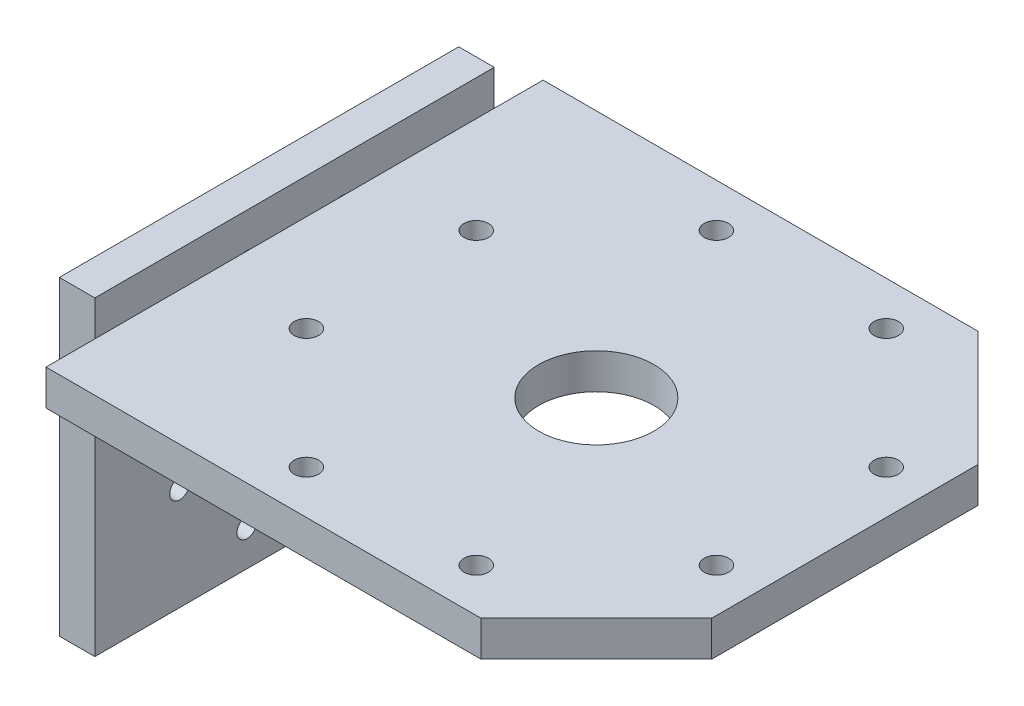
ISO-10303-21;
HEADER;
FILE_DESCRIPTION(('STEP AP214'),'2;1');
FILE_NAME('part.step','',(''),(''),'','','');
FILE_SCHEMA(('AUTOMOTIVE_DESIGN { 1 0 10303 214 1 1 1 1 }'));
ENDSEC;
DATA;
#1=APPLICATION_CONTEXT('core data for automotive mechanical design processes');
#2=APPLICATION_PROTOCOL_DEFINITION('international standard','automotive_design',2000,#1);
#3=PRODUCT_CONTEXT('',#1,'mechanical');
#4=PRODUCT('Part','Part','',(#3));
#5=PRODUCT_RELATED_PRODUCT_CATEGORY('part','',(#4));
#6=PRODUCT_DEFINITION_FORMATION('','',#4);
#7=PRODUCT_DEFINITION_CONTEXT('part definition',#1,'design');
#8=PRODUCT_DEFINITION('design','',#6,#7);
#9=PRODUCT_DEFINITION_SHAPE('','',#8);
#10=(LENGTH_UNIT() NAMED_UNIT(*) SI_UNIT(.MILLI.,.METRE.));
#11=(NAMED_UNIT(*) PLANE_ANGLE_UNIT() SI_UNIT($,.RADIAN.));
#12=(NAMED_UNIT(*) SI_UNIT($,.STERADIAN.) SOLID_ANGLE_UNIT());
#13=UNCERTAINTY_MEASURE_WITH_UNIT(LENGTH_MEASURE(1.E-05),#10,'distance_accuracy_value','');
#14=(GEOMETRIC_REPRESENTATION_CONTEXT(3) GLOBAL_UNCERTAINTY_ASSIGNED_CONTEXT((#13)) GLOBAL_UNIT_ASSIGNED_CONTEXT((#10,
#11,#12)) REPRESENTATION_CONTEXT('',''));
#15=CARTESIAN_POINT('',(0.,0.,0.));
#16=DIRECTION('',(0.,0.,1.));
#17=DIRECTION('',(1.,0.,0.));
#18=AXIS2_PLACEMENT_3D('',#15,#16,#17);
#19=CARTESIAN_POINT('',(-68.,0.,0.));
#20=DIRECTION('',(-1.,0.,0.));
#21=DIRECTION('',(0.,0.,1.));
#22=AXIS2_PLACEMENT_3D('',#19,#20,#21);
#23=PLANE('',#22);
#24=DIRECTION('',(0.,0.,1.));
#25=VECTOR('',#24,1.);
#26=CARTESIAN_POINT('',(-68.,28.,56.));
#27=LINE('',#26,#25);
#28=CARTESIAN_POINT('',(-68.,28.,-45.));
#29=VERTEX_POINT('',#28);
#30=CARTESIAN_POINT('',(-68.,28.,-11.4360721315195));
#31=VERTEX_POINT('',#30);
#32=EDGE_CURVE('E48',#29,#31,#27,.T.);
#33=ORIENTED_EDGE('',*,*,#32,.F.);
#34=DIRECTION('',(0.,1.,0.));
#35=VECTOR('',#34,1.);
#36=CARTESIAN_POINT('',(-68.,36.,-45.));
#37=LINE('',#36,#35);
#38=CARTESIAN_POINT('',(-68.,36.,-45.));
#39=VERTEX_POINT('',#38);
#40=EDGE_CURVE('E242',#29,#39,#37,.T.);
#41=ORIENTED_EDGE('',*,*,#40,.T.);
#42=DIRECTION('',(0.,0.,1.));
#43=VECTOR('',#42,1.);
#44=CARTESIAN_POINT('',(-68.,36.,45.));
#45=LINE('',#44,#43);
#46=CARTESIAN_POINT('',(-68.,36.,45.));
#47=VERTEX_POINT('',#46);
#48=EDGE_CURVE('E233',#39,#47,#45,.T.);
#49=ORIENTED_EDGE('',*,*,#48,.T.);
#50=DIRECTION('',(0.,-1.,0.));
#51=VECTOR('',#50,1.);
#52=CARTESIAN_POINT('',(-68.,-34.,45.));
#53=LINE('',#52,#51);
#54=CARTESIAN_POINT('',(-68.,28.,45.));
#55=VERTEX_POINT('',#54);
#56=EDGE_CURVE('E238',#47,#55,#53,.T.);
#57=ORIENTED_EDGE('',*,*,#56,.T.);
#58=CARTESIAN_POINT('',(-68.,28.,11.4360721315195));
#59=VERTEX_POINT('',#58);
#60=EDGE_CURVE('E155',#59,#55,#27,.T.);
#61=ORIENTED_EDGE('',*,*,#60,.F.);
#62=CARTESIAN_POINT('',(-68.,25.868626910316,10.7151361062225));
#63=DIRECTION('',(1.,0.,0.));
#64=DIRECTION('',(0.,0.,-1.));
#65=AXIS2_PLACEMENT_3D('',#62,#63,#64);
#66=CIRCLE('',#65,2.25);
#67=CARTESIAN_POINT('',(-68.,28.,9.99420008092553));
#68=VERTEX_POINT('',#67);
#69=EDGE_CURVE('E196',#68,#59,#66,.T.);
#70=ORIENTED_EDGE('',*,*,#69,.F.);
#71=CARTESIAN_POINT('',(-68.,28.,-9.99420008092556));
#72=VERTEX_POINT('',#71);
#73=EDGE_CURVE('E59',#72,#68,#27,.T.);
#74=ORIENTED_EDGE('',*,*,#73,.F.);
#75=CARTESIAN_POINT('',(-68.,25.868626910316,-10.7151361062225));
#76=DIRECTION('',(1.,0.,0.));
#77=DIRECTION('',(0.,0.,-1.));
#78=AXIS2_PLACEMENT_3D('',#75,#76,#77);
#79=CIRCLE('',#78,2.25);
#80=EDGE_CURVE('E194',#31,#72,#79,.T.);
#81=ORIENTED_EDGE('',*,*,#80,.F.);
#82=EDGE_LOOP('',(#33,#41,#49,#57,#61,#70,#74,#81));
#83=FACE_BOUND('',#82,.T.);
#84=ADVANCED_FACE('F39',(#83),#23,.F.);
#85=CARTESIAN_POINT('',(-68.,-10.7151361062225,-25.868626910316));
#86=DIRECTION('',(1.,0.,0.));
#87=DIRECTION('',(0.,0.,-1.));
#88=AXIS2_PLACEMENT_3D('',#85,#86,#87);
#89=CIRCLE('',#88,2.25);
#90=CARTESIAN_POINT('',(-68.,-10.7151361062225,-28.118626910316));
#91=VERTEX_POINT('',#90);
#92=EDGE_CURVE('E228',#91,#91,#89,.T.);
#93=ORIENTED_EDGE('',*,*,#92,.F.);
#94=EDGE_LOOP('',(#93));
#95=FACE_BOUND('',#94,.T.);
#96=CARTESIAN_POINT('',(-68.,-25.868626910316,-10.7151361062225));
#97=DIRECTION('',(1.,0.,0.));
#98=DIRECTION('',(0.,0.,-1.));
#99=AXIS2_PLACEMENT_3D('',#96,#97,#98);
#100=CIRCLE('',#99,2.25);
#101=CARTESIAN_POINT('',(-68.,-25.868626910316,-12.9651361062225));
#102=VERTEX_POINT('',#101);
#103=EDGE_CURVE('E224',#102,#102,#100,.T.);
#104=ORIENTED_EDGE('',*,*,#103,.F.);
#105=EDGE_LOOP('',(#104));
#106=FACE_BOUND('',#105,.T.);
#107=CARTESIAN_POINT('',(-68.,-25.868626910316,10.7151361062225));
#108=DIRECTION('',(1.,0.,0.));
#109=DIRECTION('',(0.,0.,-1.));
#110=AXIS2_PLACEMENT_3D('',#107,#108,#109);
#111=CIRCLE('',#110,2.25);
#112=CARTESIAN_POINT('',(-68.,-25.868626910316,8.46513610622251));
#113=VERTEX_POINT('',#112);
#114=EDGE_CURVE('E220',#113,#113,#111,.T.);
#115=ORIENTED_EDGE('',*,*,#114,.F.);
#116=EDGE_LOOP('',(#115));
#117=FACE_BOUND('',#116,.T.);
#118=CARTESIAN_POINT('',(-68.,-10.7151361062225,25.868626910316));
#119=DIRECTION('',(1.,0.,0.));
#120=DIRECTION('',(0.,0.,-1.));
#121=AXIS2_PLACEMENT_3D('',#118,#119,#120);
#122=CIRCLE('',#121,2.25);
#123=CARTESIAN_POINT('',(-68.,-10.7151361062225,23.618626910316));
#124=VERTEX_POINT('',#123);
#125=EDGE_CURVE('E211',#124,#124,#122,.T.);
#126=ORIENTED_EDGE('',*,*,#125,.F.);
#127=EDGE_LOOP('',(#126));
#128=FACE_BOUND('',#127,.T.);
#129=CARTESIAN_POINT('',(-68.,10.7151361062225,25.868626910316));
#130=DIRECTION('',(1.,0.,0.));
#131=DIRECTION('',(0.,0.,-1.));
#132=AXIS2_PLACEMENT_3D('',#129,#130,#131);
#133=CIRCLE('',#132,2.25);
#134=CARTESIAN_POINT('',(-68.,10.7151361062225,23.618626910316));
#135=VERTEX_POINT('',#134);
#136=EDGE_CURVE('E202',#135,#135,#133,.T.);
#137=ORIENTED_EDGE('',*,*,#136,.F.);
#138=EDGE_LOOP('',(#137));
#139=FACE_BOUND('',#138,.T.);
#140=CARTESIAN_POINT('',(-68.,-34.,-45.));
#141=VERTEX_POINT('',#140);
#142=CARTESIAN_POINT('',(-68.,20.,-45.));
#143=VERTEX_POINT('',#142);
#144=EDGE_CURVE('E247',#141,#143,#37,.T.);
#145=ORIENTED_EDGE('',*,*,#144,.T.);
#146=DIRECTION('',(0.,0.,1.));
#147=VECTOR('',#146,1.);
#148=CARTESIAN_POINT('',(-68.,20.,56.));
#149=LINE('',#148,#147);
#150=CARTESIAN_POINT('',(-68.,20.,45.));
#151=VERTEX_POINT('',#150);
#152=EDGE_CURVE('E11',#143,#151,#149,.T.);
#153=ORIENTED_EDGE('',*,*,#152,.T.);
#154=CARTESIAN_POINT('',(-68.,-34.,45.));
#155=VERTEX_POINT('',#154);
#156=EDGE_CURVE('E236',#151,#155,#53,.T.);
#157=ORIENTED_EDGE('',*,*,#156,.T.);
#158=DIRECTION('',(0.,0.,-1.));
#159=VECTOR('',#158,1.);
#160=CARTESIAN_POINT('',(-68.,-34.,-45.));
#161=LINE('',#160,#159);
#162=EDGE_CURVE('E241',#155,#141,#161,.T.);
#163=ORIENTED_EDGE('',*,*,#162,.T.);
#164=EDGE_LOOP('',(#145,#153,#157,#163));
#165=FACE_BOUND('',#164,.T.);
#166=CARTESIAN_POINT('',(-68.,10.7151361062225,-25.868626910316));
#167=DIRECTION('',(1.,0.,0.));
#168=DIRECTION('',(0.,0.,-1.));
#169=AXIS2_PLACEMENT_3D('',#166,#167,#168);
#170=CIRCLE('',#169,2.25);
#171=CARTESIAN_POINT('',(-68.,10.7151361062225,-28.118626910316));
#172=VERTEX_POINT('',#171);
#173=EDGE_CURVE('E186',#172,#172,#170,.T.);
#174=ORIENTED_EDGE('',*,*,#173,.F.);
#175=EDGE_LOOP('',(#174));
#176=FACE_BOUND('',#175,.T.);
#177=CARTESIAN_POINT('',(-68.,0.,0.));
#178=DIRECTION('',(1.,0.,0.));
#179=DIRECTION('',(0.,0.,-1.));
#180=AXIS2_PLACEMENT_3D('',#177,#178,#179);
#181=CIRCLE('',#180,6.);
#182=CARTESIAN_POINT('',(-68.,0.,-6.));
#183=VERTEX_POINT('',#182);
#184=EDGE_CURVE('E181',#183,#183,#181,.T.);
#185=ORIENTED_EDGE('',*,*,#184,.F.);
#186=EDGE_LOOP('',(#185));
#187=FACE_BOUND('',#186,.T.);
#188=ADVANCED_FACE('F347',(#95,#106,#117,#128,#139,#165,#176,#187),#23,.F.);
#189=CARTESIAN_POINT('',(-76.,0.,0.));
#190=DIRECTION('',(-1.,0.,0.));
#191=DIRECTION('',(0.,0.,1.));
#192=AXIS2_PLACEMENT_3D('',#189,#190,#191);
#193=PLANE('',#192);
#194=CARTESIAN_POINT('',(-76.,0.,0.));
#195=DIRECTION('',(1.,0.,0.));
#196=DIRECTION('',(0.,0.,-1.));
#197=AXIS2_PLACEMENT_3D('',#194,#195,#196);
#198=CIRCLE('',#197,22.15);
#199=CARTESIAN_POINT('',(-76.,0.,-22.15));
#200=VERTEX_POINT('',#199);
#201=EDGE_CURVE('E171',#200,#200,#198,.T.);
#202=ORIENTED_EDGE('',*,*,#201,.T.);
#203=EDGE_LOOP('',(#202));
#204=FACE_BOUND('',#203,.T.);
#205=CARTESIAN_POINT('',(-76.,10.7151361062225,-25.868626910316));
#206=DIRECTION('',(1.,0.,0.));
#207=DIRECTION('',(0.,0.,-1.));
#208=AXIS2_PLACEMENT_3D('',#205,#206,#207);
#209=CIRCLE('',#208,2.25);
#210=CARTESIAN_POINT('',(-76.,10.7151361062225,-28.118626910316));
#211=VERTEX_POINT('',#210);
#212=EDGE_CURVE('E189',#211,#211,#209,.T.);
#213=ORIENTED_EDGE('',*,*,#212,.T.);
#214=EDGE_LOOP('',(#213));
#215=FACE_BOUND('',#214,.T.);
#216=CARTESIAN_POINT('',(-76.,25.868626910316,10.7151361062225));
#217=DIRECTION('',(1.,0.,0.));
#218=DIRECTION('',(0.,0.,-1.));
#219=AXIS2_PLACEMENT_3D('',#216,#217,#218);
#220=CIRCLE('',#219,2.25);
#221=CARTESIAN_POINT('',(-76.,25.868626910316,8.46513610622251));
#222=VERTEX_POINT('',#221);
#223=EDGE_CURVE('E193',#222,#222,#220,.T.);
#224=ORIENTED_EDGE('',*,*,#223,.T.);
#225=EDGE_LOOP('',(#224));
#226=FACE_BOUND('',#225,.T.);
#227=CARTESIAN_POINT('',(-76.,-10.7151361062225,25.868626910316));
#228=DIRECTION('',(1.,0.,0.));
#229=DIRECTION('',(0.,0.,-1.));
#230=AXIS2_PLACEMENT_3D('',#227,#228,#229);
#231=CIRCLE('',#230,2.25);
#232=CARTESIAN_POINT('',(-76.,-10.7151361062225,23.618626910316));
#233=VERTEX_POINT('',#232);
#234=EDGE_CURVE('E208',#233,#233,#231,.T.);
#235=ORIENTED_EDGE('',*,*,#234,.T.);
#236=EDGE_LOOP('',(#235));
#237=FACE_BOUND('',#236,.T.);
#238=CARTESIAN_POINT('',(-76.,-25.868626910316,-10.7151361062225));
#239=DIRECTION('',(1.,0.,0.));
#240=DIRECTION('',(0.,0.,-1.));
#241=AXIS2_PLACEMENT_3D('',#238,#239,#240);
#242=CIRCLE('',#241,2.25);
#243=CARTESIAN_POINT('',(-76.,-25.868626910316,-12.9651361062225));
#244=VERTEX_POINT('',#243);
#245=EDGE_CURVE('E219',#244,#244,#242,.T.);
#246=ORIENTED_EDGE('',*,*,#245,.T.);
#247=EDGE_LOOP('',(#246));
#248=FACE_BOUND('',#247,.T.);
#249=DIRECTION('',(0.,0.,1.));
#250=VECTOR('',#249,1.);
#251=CARTESIAN_POINT('',(-76.,36.,45.));
#252=LINE('',#251,#250);
#253=CARTESIAN_POINT('',(-76.,36.,-45.));
#254=VERTEX_POINT('',#253);
#255=CARTESIAN_POINT('',(-76.,36.,45.));
#256=VERTEX_POINT('',#255);
#257=EDGE_CURVE('E235',#254,#256,#252,.T.);
#258=ORIENTED_EDGE('',*,*,#257,.F.);
#259=DIRECTION('',(0.,1.,0.));
#260=VECTOR('',#259,1.);
#261=CARTESIAN_POINT('',(-76.,36.,-45.));
#262=LINE('',#261,#260);
#263=CARTESIAN_POINT('',(-76.,-34.,-45.));
#264=VERTEX_POINT('',#263);
#265=EDGE_CURVE('E239',#264,#254,#262,.T.);
#266=ORIENTED_EDGE('',*,*,#265,.F.);
#267=DIRECTION('',(0.,0.,-1.));
#268=VECTOR('',#267,1.);
#269=CARTESIAN_POINT('',(-76.,-34.,-45.));
#270=LINE('',#269,#268);
#271=CARTESIAN_POINT('',(-76.,-34.,45.));
#272=VERTEX_POINT('',#271);
#273=EDGE_CURVE('E254',#272,#264,#270,.T.);
#274=ORIENTED_EDGE('',*,*,#273,.F.);
#275=DIRECTION('',(0.,-1.,0.));
#276=VECTOR('',#275,1.);
#277=CARTESIAN_POINT('',(-76.,-34.,45.));
#278=LINE('',#277,#276);
#279=EDGE_CURVE('E251',#256,#272,#278,.T.);
#280=ORIENTED_EDGE('',*,*,#279,.F.);
#281=EDGE_LOOP('',(#258,#266,#274,#280));
#282=FACE_BOUND('',#281,.T.);
#283=CARTESIAN_POINT('',(-76.,-10.7151361062225,-25.868626910316));
#284=DIRECTION('',(1.,0.,0.));
#285=DIRECTION('',(0.,0.,-1.));
#286=AXIS2_PLACEMENT_3D('',#283,#284,#285);
#287=CIRCLE('',#286,2.25);
#288=CARTESIAN_POINT('',(-76.,-10.7151361062225,-28.118626910316));
#289=VERTEX_POINT('',#288);
#290=EDGE_CURVE('E229',#289,#289,#287,.T.);
#291=ORIENTED_EDGE('',*,*,#290,.T.);
#292=EDGE_LOOP('',(#291));
#293=FACE_BOUND('',#292,.T.);
#294=CARTESIAN_POINT('',(-76.,-25.868626910316,10.7151361062225));
#295=DIRECTION('',(1.,0.,0.));
#296=DIRECTION('',(0.,0.,-1.));
#297=AXIS2_PLACEMENT_3D('',#294,#295,#296);
#298=CIRCLE('',#297,2.25);
#299=CARTESIAN_POINT('',(-76.,-25.868626910316,8.46513610622251));
#300=VERTEX_POINT('',#299);
#301=EDGE_CURVE('E212',#300,#300,#298,.T.);
#302=ORIENTED_EDGE('',*,*,#301,.T.);
#303=EDGE_LOOP('',(#302));
#304=FACE_BOUND('',#303,.T.);
#305=CARTESIAN_POINT('',(-76.,10.7151361062225,25.868626910316));
#306=DIRECTION('',(1.,0.,0.));
#307=DIRECTION('',(0.,0.,-1.));
#308=AXIS2_PLACEMENT_3D('',#305,#306,#307);
#309=CIRCLE('',#308,2.25);
#310=CARTESIAN_POINT('',(-76.,10.7151361062225,23.618626910316));
#311=VERTEX_POINT('',#310);
#312=EDGE_CURVE('E203',#311,#311,#309,.T.);
#313=ORIENTED_EDGE('',*,*,#312,.T.);
#314=EDGE_LOOP('',(#313));
#315=FACE_BOUND('',#314,.T.);
#316=CARTESIAN_POINT('',(-76.,25.868626910316,-10.7151361062225));
#317=DIRECTION('',(1.,0.,0.));
#318=DIRECTION('',(0.,0.,-1.));
#319=AXIS2_PLACEMENT_3D('',#316,#317,#318);
#320=CIRCLE('',#319,2.25);
#321=CARTESIAN_POINT('',(-76.,25.868626910316,-12.9651361062225));
#322=VERTEX_POINT('',#321);
#323=EDGE_CURVE('E187',#322,#322,#320,.T.);
#324=ORIENTED_EDGE('',*,*,#323,.T.);
#325=EDGE_LOOP('',(#324));
#326=FACE_BOUND('',#325,.T.);
#327=ADVANCED_FACE('F351',(#204,#215,#226,#237,#248,#282,#293,#304,#315,#326),#193,.T.);
#328=CARTESIAN_POINT('',(-68.,36.,45.));
#329=DIRECTION('',(0.,-1.,0.));
#330=DIRECTION('',(0.,0.,-1.));
#331=AXIS2_PLACEMENT_3D('',#328,#329,#330);
#332=PLANE('',#331);
#333=ORIENTED_EDGE('',*,*,#257,.T.);
#334=DIRECTION('',(-1.,0.,0.));
#335=VECTOR('',#334,1.);
#336=CARTESIAN_POINT('',(-68.,36.,45.));
#337=LINE('',#336,#335);
#338=EDGE_CURVE('E264',#47,#256,#337,.T.);
#339=ORIENTED_EDGE('',*,*,#338,.F.);
#340=ORIENTED_EDGE('',*,*,#48,.F.);
#341=DIRECTION('',(-1.,0.,0.));
#342=VECTOR('',#341,1.);
#343=CARTESIAN_POINT('',(-68.,36.,-45.));
#344=LINE('',#343,#342);
#345=EDGE_CURVE('E246',#39,#254,#344,.T.);
#346=ORIENTED_EDGE('',*,*,#345,.T.);
#347=EDGE_LOOP('',(#333,#339,#340,#346));
#348=FACE_BOUND('',#347,.T.);
#349=ADVANCED_FACE('F41',(#348),#332,.F.);
#350=CARTESIAN_POINT('',(-68.,-34.,45.));
#351=DIRECTION('',(0.,0.,-1.));
#352=DIRECTION('',(-1.,0.,0.));
#353=AXIS2_PLACEMENT_3D('',#350,#351,#352);
#354=PLANE('',#353);
#355=ORIENTED_EDGE('',*,*,#279,.T.);
#356=DIRECTION('',(-1.,0.,0.));
#357=VECTOR('',#356,1.);
#358=CARTESIAN_POINT('',(-68.,-34.,45.));
#359=LINE('',#358,#357);
#360=EDGE_CURVE('E263',#155,#272,#359,.T.);
#361=ORIENTED_EDGE('',*,*,#360,.F.);
#362=ORIENTED_EDGE('',*,*,#156,.F.);
#363=EDGE_CURVE('E245',#55,#151,#53,.T.);
#364=ORIENTED_EDGE('',*,*,#363,.F.);
#365=ORIENTED_EDGE('',*,*,#56,.F.);
#366=ORIENTED_EDGE('',*,*,#338,.T.);
#367=EDGE_LOOP('',(#355,#361,#362,#364,#365,#366));
#368=FACE_BOUND('',#367,.T.);
#369=ADVANCED_FACE('F364',(#368),#354,.F.);
#370=CARTESIAN_POINT('',(-68.,-34.,-45.));
#371=DIRECTION('',(0.,1.,0.));
#372=DIRECTION('',(0.,0.,1.));
#373=AXIS2_PLACEMENT_3D('',#370,#371,#372);
#374=PLANE('',#373);
#375=ORIENTED_EDGE('',*,*,#273,.T.);
#376=DIRECTION('',(-1.,0.,0.));
#377=VECTOR('',#376,1.);
#378=CARTESIAN_POINT('',(-68.,-34.,-45.));
#379=LINE('',#378,#377);
#380=EDGE_CURVE('E257',#141,#264,#379,.T.);
#381=ORIENTED_EDGE('',*,*,#380,.F.);
#382=ORIENTED_EDGE('',*,*,#162,.F.);
#383=ORIENTED_EDGE('',*,*,#360,.T.);
#384=EDGE_LOOP('',(#375,#381,#382,#383));
#385=FACE_BOUND('',#384,.T.);
#386=ADVANCED_FACE('F361',(#385),#374,.F.);
#387=CARTESIAN_POINT('',(-68.,36.,-45.));
#388=DIRECTION('',(0.,0.,1.));
#389=DIRECTION('',(1.,0.,0.));
#390=AXIS2_PLACEMENT_3D('',#387,#388,#389);
#391=PLANE('',#390);
#392=ORIENTED_EDGE('',*,*,#265,.T.);
#393=ORIENTED_EDGE('',*,*,#345,.F.);
#394=ORIENTED_EDGE('',*,*,#40,.F.);
#395=EDGE_CURVE('E248',#143,#29,#37,.T.);
#396=ORIENTED_EDGE('',*,*,#395,.F.);
#397=ORIENTED_EDGE('',*,*,#144,.F.);
#398=ORIENTED_EDGE('',*,*,#380,.T.);
#399=EDGE_LOOP('',(#392,#393,#394,#396,#397,#398));
#400=FACE_BOUND('',#399,.T.);
#401=ADVANCED_FACE('F276',(#400),#391,.F.);
#402=CARTESIAN_POINT('',(-68.,-10.7151361062225,-25.868626910316));
#403=DIRECTION('',(-1.,0.,0.));
#404=DIRECTION('',(0.,0.,1.));
#405=AXIS2_PLACEMENT_3D('',#402,#403,#404);
#406=CYLINDRICAL_SURFACE('',#405,2.25);
#407=ORIENTED_EDGE('',*,*,#92,.T.);
#408=EDGE_LOOP('',(#407));
#409=FACE_BOUND('',#408,.T.);
#410=ORIENTED_EDGE('',*,*,#290,.F.);
#411=EDGE_LOOP('',(#410));
#412=FACE_BOUND('',#411,.T.);
#413=ADVANCED_FACE('F357',(#409,#412),#406,.F.);
#414=CARTESIAN_POINT('',(-68.,-25.868626910316,-10.7151361062225));
#415=DIRECTION('',(-1.,0.,0.));
#416=DIRECTION('',(0.,0.,1.));
#417=AXIS2_PLACEMENT_3D('',#414,#415,#416);
#418=CYLINDRICAL_SURFACE('',#417,2.25);
#419=ORIENTED_EDGE('',*,*,#103,.T.);
#420=EDGE_LOOP('',(#419));
#421=FACE_BOUND('',#420,.T.);
#422=ORIENTED_EDGE('',*,*,#245,.F.);
#423=EDGE_LOOP('',(#422));
#424=FACE_BOUND('',#423,.T.);
#425=ADVANCED_FACE('F421',(#421,#424),#418,.F.);
#426=CARTESIAN_POINT('',(-68.,-25.868626910316,10.7151361062225));
#427=DIRECTION('',(-1.,0.,0.));
#428=DIRECTION('',(0.,0.,1.));
#429=AXIS2_PLACEMENT_3D('',#426,#427,#428);
#430=CYLINDRICAL_SURFACE('',#429,2.25);
#431=ORIENTED_EDGE('',*,*,#114,.T.);
#432=EDGE_LOOP('',(#431));
#433=FACE_BOUND('',#432,.T.);
#434=ORIENTED_EDGE('',*,*,#301,.F.);
#435=EDGE_LOOP('',(#434));
#436=FACE_BOUND('',#435,.T.);
#437=ADVANCED_FACE('F419',(#433,#436),#430,.F.);
#438=CARTESIAN_POINT('',(-68.,-10.7151361062225,25.868626910316));
#439=DIRECTION('',(-1.,0.,0.));
#440=DIRECTION('',(0.,0.,1.));
#441=AXIS2_PLACEMENT_3D('',#438,#439,#440);
#442=CYLINDRICAL_SURFACE('',#441,2.25);
#443=ORIENTED_EDGE('',*,*,#125,.T.);
#444=EDGE_LOOP('',(#443));
#445=FACE_BOUND('',#444,.T.);
#446=ORIENTED_EDGE('',*,*,#234,.F.);
#447=EDGE_LOOP('',(#446));
#448=FACE_BOUND('',#447,.T.);
#449=ADVANCED_FACE('F418',(#445,#448),#442,.F.);
#450=CARTESIAN_POINT('',(-68.,10.7151361062225,25.868626910316));
#451=DIRECTION('',(-1.,0.,0.));
#452=DIRECTION('',(0.,0.,1.));
#453=AXIS2_PLACEMENT_3D('',#450,#451,#452);
#454=CYLINDRICAL_SURFACE('',#453,2.25);
#455=ORIENTED_EDGE('',*,*,#136,.T.);
#456=EDGE_LOOP('',(#455));
#457=FACE_BOUND('',#456,.T.);
#458=ORIENTED_EDGE('',*,*,#312,.F.);
#459=EDGE_LOOP('',(#458));
#460=FACE_BOUND('',#459,.T.);
#461=ADVANCED_FACE('F415',(#457,#460),#454,.F.);
#462=CARTESIAN_POINT('',(-68.,25.868626910316,10.7151361062225));
#463=DIRECTION('',(-1.,0.,0.));
#464=DIRECTION('',(0.,0.,1.));
#465=AXIS2_PLACEMENT_3D('',#462,#463,#464);
#466=CYLINDRICAL_SURFACE('',#465,2.25);
#467=ORIENTED_EDGE('',*,*,#69,.T.);
#468=EDGE_CURVE('E205',#59,#68,#66,.T.);
#469=ORIENTED_EDGE('',*,*,#468,.T.);
#470=EDGE_LOOP('',(#467,#469));
#471=FACE_BOUND('',#470,.T.);
#472=ORIENTED_EDGE('',*,*,#223,.F.);
#473=EDGE_LOOP('',(#472));
#474=FACE_BOUND('',#473,.T.);
#475=ADVANCED_FACE('F408',(#471,#474),#466,.F.);
#476=CARTESIAN_POINT('',(-68.,25.868626910316,-10.7151361062225));
#477=DIRECTION('',(-1.,0.,0.));
#478=DIRECTION('',(0.,0.,1.));
#479=AXIS2_PLACEMENT_3D('',#476,#477,#478);
#480=CYLINDRICAL_SURFACE('',#479,2.25);
#481=ORIENTED_EDGE('',*,*,#80,.T.);
#482=EDGE_CURVE('E63',#72,#31,#79,.T.);
#483=ORIENTED_EDGE('',*,*,#482,.T.);
#484=EDGE_LOOP('',(#481,#483));
#485=FACE_BOUND('',#484,.T.);
#486=ORIENTED_EDGE('',*,*,#323,.F.);
#487=EDGE_LOOP('',(#486));
#488=FACE_BOUND('',#487,.T.);
#489=ADVANCED_FACE('F402',(#485,#488),#480,.F.);
#490=CARTESIAN_POINT('',(-68.,10.7151361062225,-25.868626910316));
#491=DIRECTION('',(-1.,0.,0.));
#492=DIRECTION('',(0.,0.,1.));
#493=AXIS2_PLACEMENT_3D('',#490,#491,#492);
#494=CYLINDRICAL_SURFACE('',#493,2.25);
#495=ORIENTED_EDGE('',*,*,#173,.T.);
#496=EDGE_LOOP('',(#495));
#497=FACE_BOUND('',#496,.T.);
#498=ORIENTED_EDGE('',*,*,#212,.F.);
#499=EDGE_LOOP('',(#498));
#500=FACE_BOUND('',#499,.T.);
#501=ADVANCED_FACE('F394',(#497,#500),#494,.F.);
#502=CARTESIAN_POINT('',(-68.,0.,0.));
#503=DIRECTION('',(-1.,0.,0.));
#504=DIRECTION('',(0.,0.,1.));
#505=AXIS2_PLACEMENT_3D('',#502,#503,#504);
#506=CYLINDRICAL_SURFACE('',#505,6.);
#507=CARTESIAN_POINT('',(-73.8,0.,0.));
#508=DIRECTION('',(1.,0.,0.));
#509=DIRECTION('',(0.,0.,-1.));
#510=AXIS2_PLACEMENT_3D('',#507,#508,#509);
#511=CIRCLE('',#510,6.);
#512=CARTESIAN_POINT('',(-73.8,0.,-6.));
#513=VERTEX_POINT('',#512);
#514=EDGE_CURVE('E43',#513,#513,#511,.T.);
#515=ORIENTED_EDGE('',*,*,#514,.F.);
#516=EDGE_LOOP('',(#515));
#517=FACE_BOUND('',#516,.T.);
#518=ORIENTED_EDGE('',*,*,#184,.T.);
#519=EDGE_LOOP('',(#518));
#520=FACE_BOUND('',#519,.T.);
#521=ADVANCED_FACE('F389',(#517,#520),#506,.F.);
#522=CARTESIAN_POINT('',(-73.8,0.,0.));
#523=DIRECTION('',(-1.,0.,0.));
#524=DIRECTION('',(0.,0.,1.));
#525=AXIS2_PLACEMENT_3D('',#522,#523,#524);
#526=CYLINDRICAL_SURFACE('',#525,22.15);
#527=CARTESIAN_POINT('',(-73.8,0.,0.));
#528=DIRECTION('',(1.,0.,0.));
#529=DIRECTION('',(0.,0.,-1.));
#530=AXIS2_PLACEMENT_3D('',#527,#528,#529);
#531=CIRCLE('',#530,22.15);
#532=CARTESIAN_POINT('',(-73.8,0.,-22.15));
#533=VERTEX_POINT('',#532);
#534=EDGE_CURVE('E172',#533,#533,#531,.T.);
#535=ORIENTED_EDGE('',*,*,#534,.T.);
#536=EDGE_LOOP('',(#535));
#537=FACE_BOUND('',#536,.T.);
#538=ORIENTED_EDGE('',*,*,#201,.F.);
#539=EDGE_LOOP('',(#538));
#540=FACE_BOUND('',#539,.T.);
#541=ADVANCED_FACE('F388',(#537,#540),#526,.F.);
#542=CARTESIAN_POINT('',(-73.8,0.,0.));
#543=DIRECTION('',(1.,0.,0.));
#544=DIRECTION('',(0.,0.,-1.));
#545=AXIS2_PLACEMENT_3D('',#542,#543,#544);
#546=PLANE('',#545);
#547=ORIENTED_EDGE('',*,*,#514,.T.);
#548=EDGE_LOOP('',(#547));
#549=FACE_BOUND('',#548,.T.);
#550=ORIENTED_EDGE('',*,*,#534,.F.);
#551=EDGE_LOOP('',(#550));
#552=FACE_BOUND('',#551,.T.);
#553=ADVANCED_FACE('F400',(#549,#552),#546,.F.);
#554=CARTESIAN_POINT('',(-68.,28.,56.));
#555=DIRECTION('',(1.,0.,0.));
#556=DIRECTION('',(0.,0.,-1.));
#557=AXIS2_PLACEMENT_3D('',#554,#555,#556);
#558=PLANE('',#557);
#559=CARTESIAN_POINT('',(-68.,28.,56.));
#560=VERTEX_POINT('',#559);
#561=EDGE_CURVE('E145',#55,#560,#27,.T.);
#562=ORIENTED_EDGE('',*,*,#561,.F.);
#563=ORIENTED_EDGE('',*,*,#363,.T.);
#564=CARTESIAN_POINT('',(-68.,20.,56.));
#565=VERTEX_POINT('',#564);
#566=EDGE_CURVE('E51',#151,#565,#149,.T.);
#567=ORIENTED_EDGE('',*,*,#566,.T.);
#568=DIRECTION('',(0.,-1.,0.));
#569=VECTOR('',#568,1.);
#570=CARTESIAN_POINT('',(-68.,28.,56.));
#571=LINE('',#570,#569);
#572=EDGE_CURVE('E162',#560,#565,#571,.T.);
#573=ORIENTED_EDGE('',*,*,#572,.F.);
#574=EDGE_LOOP('',(#562,#563,#567,#573));
#575=FACE_BOUND('',#574,.T.);
#576=ADVANCED_FACE('F166',(#575),#558,.F.);
#577=CARTESIAN_POINT('',(-68.,20.,-56.));
#578=VERTEX_POINT('',#577);
#579=EDGE_CURVE('E49',#578,#143,#149,.T.);
#580=ORIENTED_EDGE('',*,*,#579,.T.);
#581=ORIENTED_EDGE('',*,*,#395,.T.);
#582=CARTESIAN_POINT('',(-68.,28.,-56.));
#583=VERTEX_POINT('',#582);
#584=EDGE_CURVE('E157',#583,#29,#27,.T.);
#585=ORIENTED_EDGE('',*,*,#584,.F.);
#586=DIRECTION('',(0.,-1.,0.));
#587=VECTOR('',#586,1.);
#588=CARTESIAN_POINT('',(-68.,28.,-56.));
#589=LINE('',#588,#587);
#590=EDGE_CURVE('E289',#583,#578,#589,.T.);
#591=ORIENTED_EDGE('',*,*,#590,.T.);
#592=EDGE_LOOP('',(#580,#581,#585,#591));
#593=FACE_BOUND('',#592,.T.);
#594=ADVANCED_FACE('F283',(#593),#558,.F.);
#595=ORIENTED_EDGE('',*,*,#468,.F.);
#596=EDGE_CURVE('E156',#68,#59,#27,.T.);
#597=ORIENTED_EDGE('',*,*,#596,.F.);
#598=EDGE_LOOP('',(#595,#597));
#599=FACE_BOUND('',#598,.T.);
#600=ADVANCED_FACE('F551',(#599),#558,.F.);
#601=CARTESIAN_POINT('',(0.,28.,0.));
#602=DIRECTION('',(0.,-1.,0.));
#603=DIRECTION('',(0.,0.,-1.));
#604=AXIS2_PLACEMENT_3D('',#601,#602,#603);
#605=PLANE('',#604);
#606=ORIENTED_EDGE('',*,*,#584,.T.);
#607=ORIENTED_EDGE('',*,*,#32,.T.);
#608=EDGE_CURVE('E269',#31,#72,#27,.T.);
#609=ORIENTED_EDGE('',*,*,#608,.T.);
#610=ORIENTED_EDGE('',*,*,#73,.T.);
#611=ORIENTED_EDGE('',*,*,#596,.T.);
#612=ORIENTED_EDGE('',*,*,#60,.T.);
#613=ORIENTED_EDGE('',*,*,#561,.T.);
#614=DIRECTION('',(1.,0.,0.));
#615=VECTOR('',#614,1.);
#616=CARTESIAN_POINT('',(30.,28.,56.));
#617=LINE('',#616,#615);
#618=CARTESIAN_POINT('',(30.,28.,56.));
#619=VERTEX_POINT('',#618);
#620=EDGE_CURVE('E149',#560,#619,#617,.T.);
#621=ORIENTED_EDGE('',*,*,#620,.T.);
#622=DIRECTION('',(0.707106781186548,0.,-0.707106781186548));
#623=VECTOR('',#622,1.);
#624=CARTESIAN_POINT('',(56.,28.,30.));
#625=LINE('',#624,#623);
#626=CARTESIAN_POINT('',(56.,28.,30.));
#627=VERTEX_POINT('',#626);
#628=EDGE_CURVE('E170',#619,#627,#625,.T.);
#629=ORIENTED_EDGE('',*,*,#628,.T.);
#630=DIRECTION('',(0.,0.,-1.));
#631=VECTOR('',#630,1.);
#632=CARTESIAN_POINT('',(56.,28.,-30.));
#633=LINE('',#632,#631);
#634=CARTESIAN_POINT('',(56.,28.,-30.));
#635=VERTEX_POINT('',#634);
#636=EDGE_CURVE('E317',#627,#635,#633,.T.);
#637=ORIENTED_EDGE('',*,*,#636,.T.);
#638=DIRECTION('',(-0.707106781186548,0.,-0.707106781186548));
#639=VECTOR('',#638,1.);
#640=CARTESIAN_POINT('',(30.,28.,-56.));
#641=LINE('',#640,#639);
#642=CARTESIAN_POINT('',(30.,28.,-56.));
#643=VERTEX_POINT('',#642);
#644=EDGE_CURVE('E335',#635,#643,#641,.T.);
#645=ORIENTED_EDGE('',*,*,#644,.T.);
#646=DIRECTION('',(-1.,0.,0.));
#647=VECTOR('',#646,1.);
#648=CARTESIAN_POINT('',(-68.,28.,-56.));
#649=LINE('',#648,#647);
#650=EDGE_CURVE('E296',#643,#583,#649,.T.);
#651=ORIENTED_EDGE('',*,*,#650,.T.);
#652=EDGE_LOOP('',(#606,#607,#609,#610,#611,#612,#613,#621,#629,#637,#645,#651));
#653=FACE_BOUND('',#652,.T.);
#654=CARTESIAN_POINT('',(46.1939766255643,28.,-19.1341716182545));
#655=DIRECTION('',(0.,1.,0.));
#656=DIRECTION('',(0.,0.,1.));
#657=AXIS2_PLACEMENT_3D('',#654,#655,#656);
#658=CIRCLE('',#657,2.75);
#659=CARTESIAN_POINT('',(46.1939766255643,28.,-16.3841716182545));
#660=VERTEX_POINT('',#659);
#661=EDGE_CURVE('E293',#660,#660,#658,.T.);
#662=ORIENTED_EDGE('',*,*,#661,.F.);
#663=EDGE_LOOP('',(#662));
#664=FACE_BOUND('',#663,.T.);
#665=CARTESIAN_POINT('',(19.1341716182545,28.,-46.1939766255643));
#666=DIRECTION('',(0.,1.,0.));
#667=DIRECTION('',(0.,0.,1.));
#668=AXIS2_PLACEMENT_3D('',#665,#666,#667);
#669=CIRCLE('',#668,2.75);
#670=CARTESIAN_POINT('',(19.1341716182545,28.,-43.4439766255643));
#671=VERTEX_POINT('',#670);
#672=EDGE_CURVE('E754',#671,#671,#669,.T.);
#673=ORIENTED_EDGE('',*,*,#672,.F.);
#674=EDGE_LOOP('',(#673));
#675=FACE_BOUND('',#674,.T.);
#676=CARTESIAN_POINT('',(-19.1341716182545,28.,-46.1939766255643));
#677=DIRECTION('',(0.,1.,0.));
#678=DIRECTION('',(0.,0.,1.));
#679=AXIS2_PLACEMENT_3D('',#676,#677,#678);
#680=CIRCLE('',#679,2.75);
#681=CARTESIAN_POINT('',(-19.1341716182545,28.,-43.4439766255643));
#682=VERTEX_POINT('',#681);
#683=EDGE_CURVE('E746',#682,#682,#680,.T.);
#684=ORIENTED_EDGE('',*,*,#683,.F.);
#685=EDGE_LOOP('',(#684));
#686=FACE_BOUND('',#685,.T.);
#687=CARTESIAN_POINT('',(-46.1939766255643,28.,-19.1341716182545));
#688=DIRECTION('',(0.,1.,0.));
#689=DIRECTION('',(0.,0.,1.));
#690=AXIS2_PLACEMENT_3D('',#687,#688,#689);
#691=CIRCLE('',#690,2.75);
#692=CARTESIAN_POINT('',(-46.1939766255643,28.,-16.3841716182545));
#693=VERTEX_POINT('',#692);
#694=EDGE_CURVE('E745',#693,#693,#691,.T.);
#695=ORIENTED_EDGE('',*,*,#694,.F.);
#696=EDGE_LOOP('',(#695));
#697=FACE_BOUND('',#696,.T.);
#698=CARTESIAN_POINT('',(-46.1939766255643,28.,19.1341716182545));
#699=DIRECTION('',(0.,1.,0.));
#700=DIRECTION('',(0.,0.,1.));
#701=AXIS2_PLACEMENT_3D('',#698,#699,#700);
#702=CIRCLE('',#701,2.75);
#703=CARTESIAN_POINT('',(-46.1939766255643,28.,21.8841716182545));
#704=VERTEX_POINT('',#703);
#705=EDGE_CURVE('E739',#704,#704,#702,.T.);
#706=ORIENTED_EDGE('',*,*,#705,.F.);
#707=EDGE_LOOP('',(#706));
#708=FACE_BOUND('',#707,.T.);
#709=CARTESIAN_POINT('',(-19.1341716182545,28.,46.1939766255643));
#710=DIRECTION('',(0.,1.,0.));
#711=DIRECTION('',(0.,0.,1.));
#712=AXIS2_PLACEMENT_3D('',#709,#710,#711);
#713=CIRCLE('',#712,2.75);
#714=CARTESIAN_POINT('',(-19.1341716182545,28.,48.9439766255644));
#715=VERTEX_POINT('',#714);
#716=EDGE_CURVE('E728',#715,#715,#713,.T.);
#717=ORIENTED_EDGE('',*,*,#716,.F.);
#718=EDGE_LOOP('',(#717));
#719=FACE_BOUND('',#718,.T.);
#720=CARTESIAN_POINT('',(19.1341716182545,28.,46.1939766255643));
#721=DIRECTION('',(0.,1.,0.));
#722=DIRECTION('',(0.,0.,1.));
#723=AXIS2_PLACEMENT_3D('',#720,#721,#722);
#724=CIRCLE('',#723,2.75);
#725=CARTESIAN_POINT('',(19.1341716182545,28.,48.9439766255643));
#726=VERTEX_POINT('',#725);
#727=EDGE_CURVE('E723',#726,#726,#724,.T.);
#728=ORIENTED_EDGE('',*,*,#727,.F.);
#729=EDGE_LOOP('',(#728));
#730=FACE_BOUND('',#729,.T.);
#731=CARTESIAN_POINT('',(46.1939766255643,28.,19.1341716182545));
#732=DIRECTION('',(0.,1.,0.));
#733=DIRECTION('',(0.,0.,1.));
#734=AXIS2_PLACEMENT_3D('',#731,#732,#733);
#735=CIRCLE('',#734,2.75);
#736=CARTESIAN_POINT('',(46.1939766255643,28.,21.8841716182545));
#737=VERTEX_POINT('',#736);
#738=EDGE_CURVE('E719',#737,#737,#735,.T.);
#739=ORIENTED_EDGE('',*,*,#738,.F.);
#740=EDGE_LOOP('',(#739));
#741=FACE_BOUND('',#740,.T.);
#742=CARTESIAN_POINT('',(0.,28.,0.));
#743=DIRECTION('',(0.,1.,0.));
#744=DIRECTION('',(0.,0.,1.));
#745=AXIS2_PLACEMENT_3D('',#742,#743,#744);
#746=CIRCLE('',#745,13.);
#747=CARTESIAN_POINT('',(0.,28.,13.));
#748=VERTEX_POINT('',#747);
#749=EDGE_CURVE('E707',#748,#748,#746,.T.);
#750=ORIENTED_EDGE('',*,*,#749,.F.);
#751=EDGE_LOOP('',(#750));
#752=FACE_BOUND('',#751,.T.);
#753=ADVANCED_FACE('F150',(#653,#664,#675,#686,#697,#708,#719,#730,#741,#752),#605,.F.);
#754=CARTESIAN_POINT('',(0.,20.,0.));
#755=DIRECTION('',(0.,-1.,0.));
#756=DIRECTION('',(0.,0.,-1.));
#757=AXIS2_PLACEMENT_3D('',#754,#755,#756);
#758=PLANE('',#757);
#759=CARTESIAN_POINT('',(46.1939766255643,20.,19.1341716182545));
#760=DIRECTION('',(0.,1.,0.));
#761=DIRECTION('',(0.,0.,1.));
#762=AXIS2_PLACEMENT_3D('',#759,#760,#761);
#763=CIRCLE('',#762,2.75);
#764=CARTESIAN_POINT('',(46.1939766255643,20.,21.8841716182545));
#765=VERTEX_POINT('',#764);
#766=EDGE_CURVE('E714',#765,#765,#763,.T.);
#767=ORIENTED_EDGE('',*,*,#766,.T.);
#768=EDGE_LOOP('',(#767));
#769=FACE_BOUND('',#768,.T.);
#770=CARTESIAN_POINT('',(-19.1341716182545,20.,46.1939766255643));
#771=DIRECTION('',(0.,1.,0.));
#772=DIRECTION('',(0.,0.,1.));
#773=AXIS2_PLACEMENT_3D('',#770,#771,#772);
#774=CIRCLE('',#773,2.75);
#775=CARTESIAN_POINT('',(-19.1341716182545,20.,48.9439766255644));
#776=VERTEX_POINT('',#775);
#777=EDGE_CURVE('E730',#776,#776,#774,.T.);
#778=ORIENTED_EDGE('',*,*,#777,.T.);
#779=EDGE_LOOP('',(#778));
#780=FACE_BOUND('',#779,.T.);
#781=CARTESIAN_POINT('',(-46.1939766255643,20.,-19.1341716182545));
#782=DIRECTION('',(0.,1.,0.));
#783=DIRECTION('',(0.,0.,1.));
#784=AXIS2_PLACEMENT_3D('',#781,#782,#783);
#785=CIRCLE('',#784,2.75);
#786=CARTESIAN_POINT('',(-46.1939766255643,20.,-16.3841716182545));
#787=VERTEX_POINT('',#786);
#788=EDGE_CURVE('E738',#787,#787,#785,.T.);
#789=ORIENTED_EDGE('',*,*,#788,.T.);
#790=EDGE_LOOP('',(#789));
#791=FACE_BOUND('',#790,.T.);
#792=CARTESIAN_POINT('',(19.1341716182545,20.,-46.1939766255643));
#793=DIRECTION('',(0.,1.,0.));
#794=DIRECTION('',(0.,0.,1.));
#795=AXIS2_PLACEMENT_3D('',#792,#793,#794);
#796=CIRCLE('',#795,2.75);
#797=CARTESIAN_POINT('',(19.1341716182545,20.,-43.4439766255643));
#798=VERTEX_POINT('',#797);
#799=EDGE_CURVE('E753',#798,#798,#796,.T.);
#800=ORIENTED_EDGE('',*,*,#799,.T.);
#801=EDGE_LOOP('',(#800));
#802=FACE_BOUND('',#801,.T.);
#803=ORIENTED_EDGE('',*,*,#579,.F.);
#804=DIRECTION('',(-1.,0.,0.));
#805=VECTOR('',#804,1.);
#806=CARTESIAN_POINT('',(-68.,20.,-56.));
#807=LINE('',#806,#805);
#808=CARTESIAN_POINT('',(30.,20.,-56.));
#809=VERTEX_POINT('',#808);
#810=EDGE_CURVE('E160',#809,#578,#807,.T.);
#811=ORIENTED_EDGE('',*,*,#810,.F.);
#812=DIRECTION('',(-0.707106781186548,0.,-0.707106781186548));
#813=VECTOR('',#812,1.);
#814=CARTESIAN_POINT('',(30.,20.,-56.));
#815=LINE('',#814,#813);
#816=CARTESIAN_POINT('',(56.,20.,-30.));
#817=VERTEX_POINT('',#816);
#818=EDGE_CURVE('E304',#817,#809,#815,.T.);
#819=ORIENTED_EDGE('',*,*,#818,.F.);
#820=DIRECTION('',(0.,0.,-1.));
#821=VECTOR('',#820,1.);
#822=CARTESIAN_POINT('',(56.,20.,-30.));
#823=LINE('',#822,#821);
#824=CARTESIAN_POINT('',(56.,20.,30.));
#825=VERTEX_POINT('',#824);
#826=EDGE_CURVE('E302',#825,#817,#823,.T.);
#827=ORIENTED_EDGE('',*,*,#826,.F.);
#828=DIRECTION('',(0.707106781186548,0.,-0.707106781186548));
#829=VECTOR('',#828,1.);
#830=CARTESIAN_POINT('',(56.,20.,30.));
#831=LINE('',#830,#829);
#832=CARTESIAN_POINT('',(30.,20.,56.));
#833=VERTEX_POINT('',#832);
#834=EDGE_CURVE('E291',#833,#825,#831,.T.);
#835=ORIENTED_EDGE('',*,*,#834,.F.);
#836=DIRECTION('',(1.,0.,0.));
#837=VECTOR('',#836,1.);
#838=CARTESIAN_POINT('',(30.,20.,56.));
#839=LINE('',#838,#837);
#840=EDGE_CURVE('E295',#565,#833,#839,.T.);
#841=ORIENTED_EDGE('',*,*,#840,.F.);
#842=ORIENTED_EDGE('',*,*,#566,.F.);
#843=ORIENTED_EDGE('',*,*,#152,.F.);
#844=EDGE_LOOP('',(#803,#811,#819,#827,#835,#841,#842,#843));
#845=FACE_BOUND('',#844,.T.);
#846=CARTESIAN_POINT('',(46.1939766255643,20.,-19.1341716182545));
#847=DIRECTION('',(0.,1.,0.));
#848=DIRECTION('',(0.,0.,1.));
#849=AXIS2_PLACEMENT_3D('',#846,#847,#848);
#850=CIRCLE('',#849,2.75);
#851=CARTESIAN_POINT('',(46.1939766255643,20.,-16.3841716182545));
#852=VERTEX_POINT('',#851);
#853=EDGE_CURVE('E760',#852,#852,#850,.T.);
#854=ORIENTED_EDGE('',*,*,#853,.T.);
#855=EDGE_LOOP('',(#854));
#856=FACE_BOUND('',#855,.T.);
#857=CARTESIAN_POINT('',(-19.1341716182545,20.,-46.1939766255643));
#858=DIRECTION('',(0.,1.,0.));
#859=DIRECTION('',(0.,0.,1.));
#860=AXIS2_PLACEMENT_3D('',#857,#858,#859);
#861=CIRCLE('',#860,2.75);
#862=CARTESIAN_POINT('',(-19.1341716182545,20.,-43.4439766255643));
#863=VERTEX_POINT('',#862);
#864=EDGE_CURVE('E743',#863,#863,#861,.T.);
#865=ORIENTED_EDGE('',*,*,#864,.T.);
#866=EDGE_LOOP('',(#865));
#867=FACE_BOUND('',#866,.T.);
#868=CARTESIAN_POINT('',(-46.1939766255643,20.,19.1341716182545));
#869=DIRECTION('',(0.,1.,0.));
#870=DIRECTION('',(0.,0.,1.));
#871=AXIS2_PLACEMENT_3D('',#868,#869,#870);
#872=CIRCLE('',#871,2.75);
#873=CARTESIAN_POINT('',(-46.1939766255643,20.,21.8841716182545));
#874=VERTEX_POINT('',#873);
#875=EDGE_CURVE('E731',#874,#874,#872,.T.);
#876=ORIENTED_EDGE('',*,*,#875,.T.);
#877=EDGE_LOOP('',(#876));
#878=FACE_BOUND('',#877,.T.);
#879=CARTESIAN_POINT('',(19.1341716182545,20.,46.1939766255643));
#880=DIRECTION('',(0.,1.,0.));
#881=DIRECTION('',(0.,0.,1.));
#882=AXIS2_PLACEMENT_3D('',#879,#880,#881);
#883=CIRCLE('',#882,2.75);
#884=CARTESIAN_POINT('',(19.1341716182545,20.,48.9439766255643));
#885=VERTEX_POINT('',#884);
#886=EDGE_CURVE('E724',#885,#885,#883,.T.);
#887=ORIENTED_EDGE('',*,*,#886,.T.);
#888=EDGE_LOOP('',(#887));
#889=FACE_BOUND('',#888,.T.);
#890=CARTESIAN_POINT('',(0.,20.,0.));
#891=DIRECTION('',(0.,1.,0.));
#892=DIRECTION('',(0.,0.,1.));
#893=AXIS2_PLACEMENT_3D('',#890,#891,#892);
#894=CIRCLE('',#893,13.);
#895=CARTESIAN_POINT('',(0.,20.,13.));
#896=VERTEX_POINT('',#895);
#897=EDGE_CURVE('E715',#896,#896,#894,.T.);
#898=ORIENTED_EDGE('',*,*,#897,.T.);
#899=EDGE_LOOP('',(#898));
#900=FACE_BOUND('',#899,.T.);
#901=ADVANCED_FACE('F323',(#769,#780,#791,#802,#845,#856,#867,#878,#889,#900),#758,.T.);
#902=ORIENTED_EDGE('',*,*,#482,.F.);
#903=ORIENTED_EDGE('',*,*,#608,.F.);
#904=EDGE_LOOP('',(#902,#903));
#905=FACE_BOUND('',#904,.T.);
#906=ADVANCED_FACE('F344',(#905),#558,.F.);
#907=CARTESIAN_POINT('',(30.,28.,56.));
#908=DIRECTION('',(0.,0.,-1.));
#909=DIRECTION('',(-1.,0.,0.));
#910=AXIS2_PLACEMENT_3D('',#907,#908,#909);
#911=PLANE('',#910);
#912=ORIENTED_EDGE('',*,*,#840,.T.);
#913=DIRECTION('',(0.,-1.,0.));
#914=VECTOR('',#913,1.);
#915=CARTESIAN_POINT('',(30.,28.,56.));
#916=LINE('',#915,#914);
#917=EDGE_CURVE('E164',#619,#833,#916,.T.);
#918=ORIENTED_EDGE('',*,*,#917,.F.);
#919=ORIENTED_EDGE('',*,*,#620,.F.);
#920=ORIENTED_EDGE('',*,*,#572,.T.);
#921=EDGE_LOOP('',(#912,#918,#919,#920));
#922=FACE_BOUND('',#921,.T.);
#923=ADVANCED_FACE('F165',(#922),#911,.F.);
#924=CARTESIAN_POINT('',(56.,28.,30.));
#925=DIRECTION('',(-0.707106781186547,0.,-0.707106781186547));
#926=DIRECTION('',(-0.707106781186548,0.,0.707106781186548));
#927=AXIS2_PLACEMENT_3D('',#924,#925,#926);
#928=PLANE('',#927);
#929=ORIENTED_EDGE('',*,*,#834,.T.);
#930=DIRECTION('',(0.,-1.,0.));
#931=VECTOR('',#930,1.);
#932=CARTESIAN_POINT('',(56.,28.,30.));
#933=LINE('',#932,#931);
#934=EDGE_CURVE('E180',#627,#825,#933,.T.);
#935=ORIENTED_EDGE('',*,*,#934,.F.);
#936=ORIENTED_EDGE('',*,*,#628,.F.);
#937=ORIENTED_EDGE('',*,*,#917,.T.);
#938=EDGE_LOOP('',(#929,#935,#936,#937));
#939=FACE_BOUND('',#938,.T.);
#940=ADVANCED_FACE('F333',(#939),#928,.F.);
#941=CARTESIAN_POINT('',(56.,28.,-30.));
#942=DIRECTION('',(-1.,0.,0.));
#943=DIRECTION('',(0.,0.,1.));
#944=AXIS2_PLACEMENT_3D('',#941,#942,#943);
#945=PLANE('',#944);
#946=ORIENTED_EDGE('',*,*,#826,.T.);
#947=DIRECTION('',(0.,-1.,0.));
#948=VECTOR('',#947,1.);
#949=CARTESIAN_POINT('',(56.,28.,-30.));
#950=LINE('',#949,#948);
#951=EDGE_CURVE('E309',#635,#817,#950,.T.);
#952=ORIENTED_EDGE('',*,*,#951,.F.);
#953=ORIENTED_EDGE('',*,*,#636,.F.);
#954=ORIENTED_EDGE('',*,*,#934,.T.);
#955=EDGE_LOOP('',(#946,#952,#953,#954));
#956=FACE_BOUND('',#955,.T.);
#957=ADVANCED_FACE('F320',(#956),#945,.F.);
#958=CARTESIAN_POINT('',(30.,28.,-56.));
#959=DIRECTION('',(-0.707106781186547,0.,0.707106781186547));
#960=DIRECTION('',(0.707106781186548,0.,0.707106781186548));
#961=AXIS2_PLACEMENT_3D('',#958,#959,#960);
#962=PLANE('',#961);
#963=ORIENTED_EDGE('',*,*,#818,.T.);
#964=DIRECTION('',(0.,-1.,0.));
#965=VECTOR('',#964,1.);
#966=CARTESIAN_POINT('',(30.,28.,-56.));
#967=LINE('',#966,#965);
#968=EDGE_CURVE('E307',#643,#809,#967,.T.);
#969=ORIENTED_EDGE('',*,*,#968,.F.);
#970=ORIENTED_EDGE('',*,*,#644,.F.);
#971=ORIENTED_EDGE('',*,*,#951,.T.);
#972=EDGE_LOOP('',(#963,#969,#970,#971));
#973=FACE_BOUND('',#972,.T.);
#974=ADVANCED_FACE('F330',(#973),#962,.F.);
#975=CARTESIAN_POINT('',(-68.,28.,-56.));
#976=DIRECTION('',(0.,0.,1.));
#977=DIRECTION('',(1.,0.,0.));
#978=AXIS2_PLACEMENT_3D('',#975,#976,#977);
#979=PLANE('',#978);
#980=ORIENTED_EDGE('',*,*,#810,.T.);
#981=ORIENTED_EDGE('',*,*,#590,.F.);
#982=ORIENTED_EDGE('',*,*,#650,.F.);
#983=ORIENTED_EDGE('',*,*,#968,.T.);
#984=EDGE_LOOP('',(#980,#981,#982,#983));
#985=FACE_BOUND('',#984,.T.);
#986=ADVANCED_FACE('F332',(#985),#979,.F.);
#987=CARTESIAN_POINT('',(46.1939766255643,28.,-19.1341716182545));
#988=DIRECTION('',(0.,-1.,0.));
#989=DIRECTION('',(0.,0.,-1.));
#990=AXIS2_PLACEMENT_3D('',#987,#988,#989);
#991=CYLINDRICAL_SURFACE('',#990,2.75);
#992=ORIENTED_EDGE('',*,*,#661,.T.);
#993=EDGE_LOOP('',(#992));
#994=FACE_BOUND('',#993,.T.);
#995=ORIENTED_EDGE('',*,*,#853,.F.);
#996=EDGE_LOOP('',(#995));
#997=FACE_BOUND('',#996,.T.);
#998=ADVANCED_FACE('F614',(#994,#997),#991,.F.);
#999=CARTESIAN_POINT('',(19.1341716182545,28.,-46.1939766255643));
#1000=DIRECTION('',(0.,-1.,0.));
#1001=DIRECTION('',(0.,0.,-1.));
#1002=AXIS2_PLACEMENT_3D('',#999,#1000,#1001);
#1003=CYLINDRICAL_SURFACE('',#1002,2.75);
#1004=ORIENTED_EDGE('',*,*,#672,.T.);
#1005=EDGE_LOOP('',(#1004));
#1006=FACE_BOUND('',#1005,.T.);
#1007=ORIENTED_EDGE('',*,*,#799,.F.);
#1008=EDGE_LOOP('',(#1007));
#1009=FACE_BOUND('',#1008,.T.);
#1010=ADVANCED_FACE('F616',(#1006,#1009),#1003,.F.);
#1011=CARTESIAN_POINT('',(-19.1341716182545,28.,-46.1939766255643));
#1012=DIRECTION('',(0.,-1.,0.));
#1013=DIRECTION('',(0.,0.,-1.));
#1014=AXIS2_PLACEMENT_3D('',#1011,#1012,#1013);
#1015=CYLINDRICAL_SURFACE('',#1014,2.75);
#1016=ORIENTED_EDGE('',*,*,#683,.T.);
#1017=EDGE_LOOP('',(#1016));
#1018=FACE_BOUND('',#1017,.T.);
#1019=ORIENTED_EDGE('',*,*,#864,.F.);
#1020=EDGE_LOOP('',(#1019));
#1021=FACE_BOUND('',#1020,.T.);
#1022=ADVANCED_FACE('F630',(#1018,#1021),#1015,.F.);
#1023=CARTESIAN_POINT('',(-46.1939766255643,28.,-19.1341716182545));
#1024=DIRECTION('',(0.,-1.,0.));
#1025=DIRECTION('',(0.,0.,-1.));
#1026=AXIS2_PLACEMENT_3D('',#1023,#1024,#1025);
#1027=CYLINDRICAL_SURFACE('',#1026,2.75);
#1028=ORIENTED_EDGE('',*,*,#694,.T.);
#1029=EDGE_LOOP('',(#1028));
#1030=FACE_BOUND('',#1029,.T.);
#1031=ORIENTED_EDGE('',*,*,#788,.F.);
#1032=EDGE_LOOP('',(#1031));
#1033=FACE_BOUND('',#1032,.T.);
#1034=ADVANCED_FACE('F637',(#1030,#1033),#1027,.F.);
#1035=CARTESIAN_POINT('',(-46.1939766255643,28.,19.1341716182545));
#1036=DIRECTION('',(0.,-1.,0.));
#1037=DIRECTION('',(0.,0.,-1.));
#1038=AXIS2_PLACEMENT_3D('',#1035,#1036,#1037);
#1039=CYLINDRICAL_SURFACE('',#1038,2.75);
#1040=ORIENTED_EDGE('',*,*,#705,.T.);
#1041=EDGE_LOOP('',(#1040));
#1042=FACE_BOUND('',#1041,.T.);
#1043=ORIENTED_EDGE('',*,*,#875,.F.);
#1044=EDGE_LOOP('',(#1043));
#1045=FACE_BOUND('',#1044,.T.);
#1046=ADVANCED_FACE('F646',(#1042,#1045),#1039,.F.);
#1047=CARTESIAN_POINT('',(-19.1341716182545,28.,46.1939766255643));
#1048=DIRECTION('',(0.,-1.,0.));
#1049=DIRECTION('',(0.,0.,-1.));
#1050=AXIS2_PLACEMENT_3D('',#1047,#1048,#1049);
#1051=CYLINDRICAL_SURFACE('',#1050,2.75);
#1052=ORIENTED_EDGE('',*,*,#716,.T.);
#1053=EDGE_LOOP('',(#1052));
#1054=FACE_BOUND('',#1053,.T.);
#1055=ORIENTED_EDGE('',*,*,#777,.F.);
#1056=EDGE_LOOP('',(#1055));
#1057=FACE_BOUND('',#1056,.T.);
#1058=ADVANCED_FACE('F654',(#1054,#1057),#1051,.F.);
#1059=CARTESIAN_POINT('',(19.1341716182545,28.,46.1939766255643));
#1060=DIRECTION('',(0.,-1.,0.));
#1061=DIRECTION('',(0.,0.,-1.));
#1062=AXIS2_PLACEMENT_3D('',#1059,#1060,#1061);
#1063=CYLINDRICAL_SURFACE('',#1062,2.75);
#1064=ORIENTED_EDGE('',*,*,#727,.T.);
#1065=EDGE_LOOP('',(#1064));
#1066=FACE_BOUND('',#1065,.T.);
#1067=ORIENTED_EDGE('',*,*,#886,.F.);
#1068=EDGE_LOOP('',(#1067));
#1069=FACE_BOUND('',#1068,.T.);
#1070=ADVANCED_FACE('F661',(#1066,#1069),#1063,.F.);
#1071=CARTESIAN_POINT('',(46.1939766255643,28.,19.1341716182545));
#1072=DIRECTION('',(0.,-1.,0.));
#1073=DIRECTION('',(0.,0.,-1.));
#1074=AXIS2_PLACEMENT_3D('',#1071,#1072,#1073);
#1075=CYLINDRICAL_SURFACE('',#1074,2.75);
#1076=ORIENTED_EDGE('',*,*,#738,.T.);
#1077=EDGE_LOOP('',(#1076));
#1078=FACE_BOUND('',#1077,.T.);
#1079=ORIENTED_EDGE('',*,*,#766,.F.);
#1080=EDGE_LOOP('',(#1079));
#1081=FACE_BOUND('',#1080,.T.);
#1082=ADVANCED_FACE('F674',(#1078,#1081),#1075,.F.);
#1083=CARTESIAN_POINT('',(0.,28.,0.));
#1084=DIRECTION('',(0.,-1.,0.));
#1085=DIRECTION('',(0.,0.,-1.));
#1086=AXIS2_PLACEMENT_3D('',#1083,#1084,#1085);
#1087=CYLINDRICAL_SURFACE('',#1086,13.);
#1088=ORIENTED_EDGE('',*,*,#749,.T.);
#1089=EDGE_LOOP('',(#1088));
#1090=FACE_BOUND('',#1089,.T.);
#1091=ORIENTED_EDGE('',*,*,#897,.F.);
#1092=EDGE_LOOP('',(#1091));
#1093=FACE_BOUND('',#1092,.T.);
#1094=ADVANCED_FACE('F681',(#1090,#1093),#1087,.F.);
#1095=CLOSED_SHELL('',(#84,#188,#327,#349,#369,#386,#401,#413,#425,#437,#449,#461,#475,#489,
#501,#521,#541,#553,#576,#594,#600,#753,#901,#906,#923,#940,#957,#974,#986,#998,#1010,#1022,
#1034,#1046,#1058,#1070,#1082,#1094));
#1096=MANIFOLD_SOLID_BREP('B2',#1095);
#1097=ADVANCED_BREP_SHAPE_REPRESENTATION('',(#18,#1096),#14);
#1098=SHAPE_DEFINITION_REPRESENTATION(#9,#1097);
ENDSEC;
END-ISO-10303-21;
